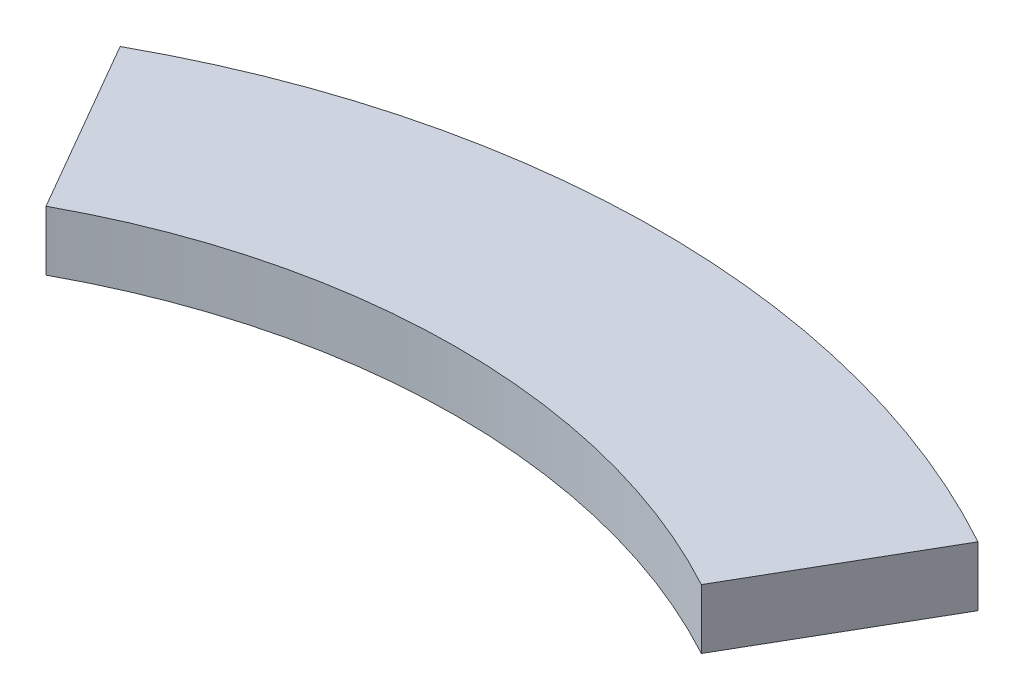
ISO-10303-21;
HEADER;
FILE_DESCRIPTION(('STEP AP214'),'2;1');
FILE_NAME('part.step','',(''),(''),'','','');
FILE_SCHEMA(('AUTOMOTIVE_DESIGN { 1 0 10303 214 1 1 1 1 }'));
ENDSEC;
DATA;
#1=APPLICATION_CONTEXT('core data for automotive mechanical design processes');
#2=APPLICATION_PROTOCOL_DEFINITION('international standard','automotive_design',2000,#1);
#3=PRODUCT_CONTEXT('',#1,'mechanical');
#4=PRODUCT('Part','Part','',(#3));
#5=PRODUCT_RELATED_PRODUCT_CATEGORY('part','',(#4));
#6=PRODUCT_DEFINITION_FORMATION('','',#4);
#7=PRODUCT_DEFINITION_CONTEXT('part definition',#1,'design');
#8=PRODUCT_DEFINITION('design','',#6,#7);
#9=PRODUCT_DEFINITION_SHAPE('','',#8);
#10=(LENGTH_UNIT() NAMED_UNIT(*) SI_UNIT(.MILLI.,.METRE.));
#11=(NAMED_UNIT(*) PLANE_ANGLE_UNIT() SI_UNIT($,.RADIAN.));
#12=(NAMED_UNIT(*) SI_UNIT($,.STERADIAN.) SOLID_ANGLE_UNIT());
#13=UNCERTAINTY_MEASURE_WITH_UNIT(LENGTH_MEASURE(1.E-05),#10,'distance_accuracy_value','');
#14=(GEOMETRIC_REPRESENTATION_CONTEXT(3) GLOBAL_UNCERTAINTY_ASSIGNED_CONTEXT((#13)) GLOBAL_UNIT_ASSIGNED_CONTEXT((#10,
#11,#12)) REPRESENTATION_CONTEXT('',''));
#15=CARTESIAN_POINT('',(0.,0.,0.));
#16=DIRECTION('',(0.,0.,1.));
#17=DIRECTION('',(1.,0.,0.));
#18=AXIS2_PLACEMENT_3D('',#15,#16,#17);
#19=CARTESIAN_POINT('',(0.,2.5,0.));
#20=DIRECTION('',(0.,-1.,0.));
#21=DIRECTION('',(0.,0.,-1.));
#22=AXIS2_PLACEMENT_3D('',#19,#20,#21);
#23=CYLINDRICAL_SURFACE('',#22,37.25);
#24=CARTESIAN_POINT('',(0.,0.,0.));
#25=DIRECTION('',(0.,1.,0.));
#26=DIRECTION('',(0.,0.,-1.));
#27=AXIS2_PLACEMENT_3D('',#24,#25,#26);
#28=CIRCLE('',#27,37.25);
#29=CARTESIAN_POINT('',(17.9717053966978,0.,-32.6279068457403));
#30=VERTEX_POINT('',#29);
#31=CARTESIAN_POINT('',(-17.9717053966979,0.,-32.6279068457402));
#32=VERTEX_POINT('',#31);
#33=EDGE_CURVE('E113',#30,#32,#28,.T.);
#34=ORIENTED_EDGE('',*,*,#33,.T.);
#35=DIRECTION('',(0.,-1.,0.));
#36=VECTOR('',#35,1.);
#37=CARTESIAN_POINT('',(-17.9717053966979,2.5,-32.6279068457402));
#38=LINE('',#37,#36);
#39=CARTESIAN_POINT('',(-17.9717053966979,2.5,-32.6279068457402));
#40=VERTEX_POINT('',#39);
#41=EDGE_CURVE('E11',#40,#32,#38,.T.);
#42=ORIENTED_EDGE('',*,*,#41,.F.);
#43=CARTESIAN_POINT('',(0.,2.5,0.));
#44=DIRECTION('',(0.,1.,0.));
#45=DIRECTION('',(0.,0.,-1.));
#46=AXIS2_PLACEMENT_3D('',#43,#44,#45);
#47=CIRCLE('',#46,37.25);
#48=CARTESIAN_POINT('',(17.9717053966978,2.5,-32.6279068457403));
#49=VERTEX_POINT('',#48);
#50=EDGE_CURVE('E97',#49,#40,#47,.T.);
#51=ORIENTED_EDGE('',*,*,#50,.F.);
#52=DIRECTION('',(0.,-1.,0.));
#53=VECTOR('',#52,1.);
#54=CARTESIAN_POINT('',(17.9717053966978,2.5,-32.6279068457403));
#55=LINE('',#54,#53);
#56=EDGE_CURVE('E109',#49,#30,#55,.T.);
#57=ORIENTED_EDGE('',*,*,#56,.T.);
#58=EDGE_LOOP('',(#34,#42,#51,#57));
#59=FACE_BOUND('',#58,.T.);
#60=ADVANCED_FACE('F45',(#59),#23,.T.);
#61=CARTESIAN_POINT('',(-17.9717053966979,2.5,-32.6279068457402));
#62=DIRECTION('',(0.866025403784436,0.,-0.500000000000004));
#63=DIRECTION('',(-0.500000000000004,0.,-0.866025403784436));
#64=AXIS2_PLACEMENT_3D('',#61,#62,#63);
#65=PLANE('',#64);
#66=DIRECTION('',(0.500000000000004,0.,0.866025403784436));
#67=VECTOR('',#66,1.);
#68=CARTESIAN_POINT('',(-17.9717053966979,0.,-32.6279068457402));
#69=LINE('',#68,#67);
#70=CARTESIAN_POINT('',(-13.7292564976257,0.,-25.2797698040326));
#71=VERTEX_POINT('',#70);
#72=EDGE_CURVE('E102',#32,#71,#69,.T.);
#73=ORIENTED_EDGE('',*,*,#72,.T.);
#74=DIRECTION('',(0.,-1.,0.));
#75=VECTOR('',#74,1.);
#76=CARTESIAN_POINT('',(-13.7292564976257,2.5,-25.2797698040326));
#77=LINE('',#76,#75);
#78=CARTESIAN_POINT('',(-13.7292564976257,2.5,-25.2797698040326));
#79=VERTEX_POINT('',#78);
#80=EDGE_CURVE('E54',#79,#71,#77,.T.);
#81=ORIENTED_EDGE('',*,*,#80,.F.);
#82=DIRECTION('',(0.500000000000004,0.,0.866025403784436));
#83=VECTOR('',#82,1.);
#84=CARTESIAN_POINT('',(-17.9717053966979,2.5,-32.6279068457402));
#85=LINE('',#84,#83);
#86=EDGE_CURVE('E92',#40,#79,#85,.T.);
#87=ORIENTED_EDGE('',*,*,#86,.F.);
#88=ORIENTED_EDGE('',*,*,#41,.T.);
#89=EDGE_LOOP('',(#73,#81,#87,#88));
#90=FACE_BOUND('',#89,.T.);
#91=ADVANCED_FACE('F101',(#90),#65,.F.);
#92=CARTESIAN_POINT('',(0.,2.5,0.));
#93=DIRECTION('',(0.,-1.,0.));
#94=DIRECTION('',(0.,0.,-1.));
#95=AXIS2_PLACEMENT_3D('',#92,#93,#94);
#96=CYLINDRICAL_SURFACE('',#95,28.7673294784635);
#97=CARTESIAN_POINT('',(0.,0.,0.));
#98=DIRECTION('',(0.,-1.,0.));
#99=DIRECTION('',(0.,0.,-1.));
#100=AXIS2_PLACEMENT_3D('',#97,#98,#99);
#101=CIRCLE('',#100,28.7673294784635);
#102=CARTESIAN_POINT('',(13.7292564976256,0.,-25.2797698040326));
#103=VERTEX_POINT('',#102);
#104=EDGE_CURVE('E79',#71,#103,#101,.T.);
#105=ORIENTED_EDGE('',*,*,#104,.T.);
#106=DIRECTION('',(0.,-1.,0.));
#107=VECTOR('',#106,1.);
#108=CARTESIAN_POINT('',(13.7292564976256,2.5,-25.2797698040326));
#109=LINE('',#108,#107);
#110=CARTESIAN_POINT('',(13.7292564976256,2.5,-25.2797698040326));
#111=VERTEX_POINT('',#110);
#112=EDGE_CURVE('E104',#111,#103,#109,.T.);
#113=ORIENTED_EDGE('',*,*,#112,.F.);
#114=CARTESIAN_POINT('',(0.,2.5,0.));
#115=DIRECTION('',(0.,-1.,0.));
#116=DIRECTION('',(0.,0.,-1.));
#117=AXIS2_PLACEMENT_3D('',#114,#115,#116);
#118=CIRCLE('',#117,28.7673294784635);
#119=EDGE_CURVE('E95',#79,#111,#118,.T.);
#120=ORIENTED_EDGE('',*,*,#119,.F.);
#121=ORIENTED_EDGE('',*,*,#80,.T.);
#122=EDGE_LOOP('',(#105,#113,#120,#121));
#123=FACE_BOUND('',#122,.T.);
#124=ADVANCED_FACE('F105',(#123),#96,.F.);
#125=CARTESIAN_POINT('',(17.9717053966978,2.5,-32.6279068457403));
#126=DIRECTION('',(-0.866025403784441,0.,-0.499999999999996));
#127=DIRECTION('',(-0.499999999999996,0.,0.866025403784441));
#128=AXIS2_PLACEMENT_3D('',#125,#126,#127);
#129=PLANE('',#128);
#130=DIRECTION('',(0.499999999999996,0.,-0.866025403784441));
#131=VECTOR('',#130,1.);
#132=CARTESIAN_POINT('',(17.9717053966978,0.,-32.6279068457403));
#133=LINE('',#132,#131);
#134=EDGE_CURVE('E85',#103,#30,#133,.T.);
#135=ORIENTED_EDGE('',*,*,#134,.T.);
#136=ORIENTED_EDGE('',*,*,#56,.F.);
#137=DIRECTION('',(0.499999999999996,0.,-0.866025403784441));
#138=VECTOR('',#137,1.);
#139=CARTESIAN_POINT('',(17.9717053966978,2.5,-32.6279068457403));
#140=LINE('',#139,#138);
#141=EDGE_CURVE('E62',#111,#49,#140,.T.);
#142=ORIENTED_EDGE('',*,*,#141,.F.);
#143=ORIENTED_EDGE('',*,*,#112,.T.);
#144=EDGE_LOOP('',(#135,#136,#142,#143));
#145=FACE_BOUND('',#144,.T.);
#146=ADVANCED_FACE('F127',(#145),#129,.F.);
#147=CARTESIAN_POINT('',(0.,2.5,0.));
#148=DIRECTION('',(0.,-1.,0.));
#149=DIRECTION('',(0.,0.,-1.));
#150=AXIS2_PLACEMENT_3D('',#147,#148,#149);
#151=PLANE('',#150);
#152=ORIENTED_EDGE('',*,*,#50,.T.);
#153=ORIENTED_EDGE('',*,*,#86,.T.);
#154=ORIENTED_EDGE('',*,*,#119,.T.);
#155=ORIENTED_EDGE('',*,*,#141,.T.);
#156=EDGE_LOOP('',(#152,#153,#154,#155));
#157=FACE_BOUND('',#156,.T.);
#158=ADVANCED_FACE('F93',(#157),#151,.F.);
#159=CARTESIAN_POINT('',(0.,0.,0.));
#160=DIRECTION('',(0.,-1.,0.));
#161=DIRECTION('',(0.,0.,-1.));
#162=AXIS2_PLACEMENT_3D('',#159,#160,#161);
#163=PLANE('',#162);
#164=CARTESIAN_POINT('',(0.,0.,-33.0086647392318));
#165=DIRECTION('',(0.,-1.,0.));
#166=DIRECTION('',(0.,0.,-1.));
#167=AXIS2_PLACEMENT_3D('',#164,#165,#166);
#168=CIRCLE('',#167,1.625);
#169=CARTESIAN_POINT('',(0.,0.,-34.6336647392318));
#170=VERTEX_POINT('',#169);
#171=EDGE_CURVE('E134',#170,#170,#168,.T.);
#172=ORIENTED_EDGE('',*,*,#171,.F.);
#173=EDGE_LOOP('',(#172));
#174=FACE_BOUND('',#173,.T.);
#175=ORIENTED_EDGE('',*,*,#33,.F.);
#176=ORIENTED_EDGE('',*,*,#134,.F.);
#177=ORIENTED_EDGE('',*,*,#104,.F.);
#178=ORIENTED_EDGE('',*,*,#72,.F.);
#179=EDGE_LOOP('',(#175,#176,#177,#178));
#180=FACE_BOUND('',#179,.T.);
#181=ADVANCED_FACE('F130',(#174,#180),#163,.T.);
#182=CARTESIAN_POINT('',(0.,2.,-33.0086647392318));
#183=DIRECTION('',(0.,-1.,0.));
#184=DIRECTION('',(0.,0.,-1.));
#185=AXIS2_PLACEMENT_3D('',#182,#183,#184);
#186=CYLINDRICAL_SURFACE('',#185,1.625);
#187=CARTESIAN_POINT('',(0.,2.,-33.0086647392318));
#188=DIRECTION('',(0.,-1.,0.));
#189=DIRECTION('',(0.,0.,-1.));
#190=AXIS2_PLACEMENT_3D('',#187,#188,#189);
#191=CIRCLE('',#190,1.625);
#192=CARTESIAN_POINT('',(0.,2.,-34.6336647392318));
#193=VERTEX_POINT('',#192);
#194=EDGE_CURVE('E117',#193,#193,#191,.T.);
#195=ORIENTED_EDGE('',*,*,#194,.F.);
#196=EDGE_LOOP('',(#195));
#197=FACE_BOUND('',#196,.T.);
#198=ORIENTED_EDGE('',*,*,#171,.T.);
#199=EDGE_LOOP('',(#198));
#200=FACE_BOUND('',#199,.T.);
#201=ADVANCED_FACE('F144',(#197,#200),#186,.F.);
#202=CARTESIAN_POINT('',(0.,2.,-33.0086647392318));
#203=DIRECTION('',(0.,-1.,0.));
#204=DIRECTION('',(0.,0.,-1.));
#205=AXIS2_PLACEMENT_3D('',#202,#203,#204);
#206=PLANE('',#205);
#207=ORIENTED_EDGE('',*,*,#194,.T.);
#208=EDGE_LOOP('',(#207));
#209=FACE_BOUND('',#208,.T.);
#210=ADVANCED_FACE('F142',(#209),#206,.T.);
#211=CLOSED_SHELL('',(#60,#91,#124,#146,#158,#181,#201,#210));
#212=MANIFOLD_SOLID_BREP('B2',#211);
#213=ADVANCED_BREP_SHAPE_REPRESENTATION('',(#18,#212),#14);
#214=SHAPE_DEFINITION_REPRESENTATION(#9,#213);
ENDSEC;
END-ISO-10303-21;
